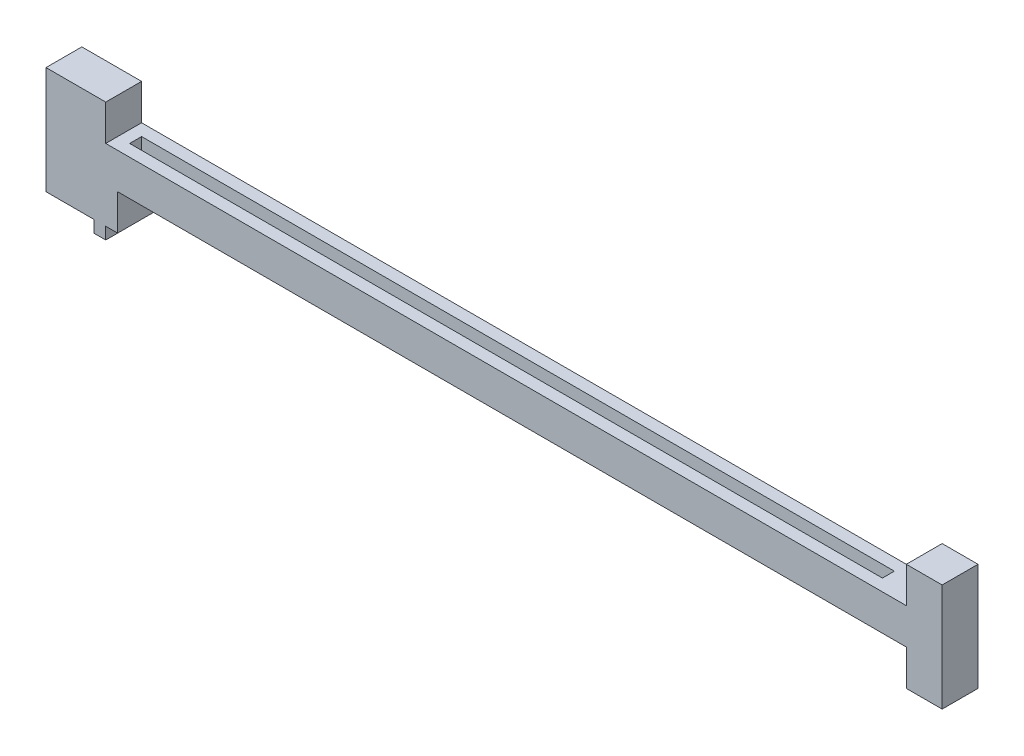
ISO-10303-21;
HEADER;
FILE_DESCRIPTION(('STEP AP214'),'2;1');
FILE_NAME('part.step','',(''),(''),'','','');
FILE_SCHEMA(('AUTOMOTIVE_DESIGN { 1 0 10303 214 1 1 1 1 }'));
ENDSEC;
DATA;
#1=APPLICATION_CONTEXT('core data for automotive mechanical design processes');
#2=APPLICATION_PROTOCOL_DEFINITION('international standard','automotive_design',2000,#1);
#3=PRODUCT_CONTEXT('',#1,'mechanical');
#4=PRODUCT('Part','Part','',(#3));
#5=PRODUCT_RELATED_PRODUCT_CATEGORY('part','',(#4));
#6=PRODUCT_DEFINITION_FORMATION('','',#4);
#7=PRODUCT_DEFINITION_CONTEXT('part definition',#1,'design');
#8=PRODUCT_DEFINITION('design','',#6,#7);
#9=PRODUCT_DEFINITION_SHAPE('','',#8);
#10=(LENGTH_UNIT() NAMED_UNIT(*) SI_UNIT(.MILLI.,.METRE.));
#11=(NAMED_UNIT(*) PLANE_ANGLE_UNIT() SI_UNIT($,.RADIAN.));
#12=(NAMED_UNIT(*) SI_UNIT($,.STERADIAN.) SOLID_ANGLE_UNIT());
#13=UNCERTAINTY_MEASURE_WITH_UNIT(LENGTH_MEASURE(1.E-05),#10,'distance_accuracy_value','');
#14=(GEOMETRIC_REPRESENTATION_CONTEXT(3) GLOBAL_UNCERTAINTY_ASSIGNED_CONTEXT((#13)) GLOBAL_UNIT_ASSIGNED_CONTEXT((#10,
#11,#12)) REPRESENTATION_CONTEXT('',''));
#15=CARTESIAN_POINT('',(0.,0.,0.));
#16=DIRECTION('',(0.,0.,1.));
#17=DIRECTION('',(1.,0.,0.));
#18=AXIS2_PLACEMENT_3D('',#15,#16,#17);
#19=CARTESIAN_POINT('',(-55.,-2.5,5.));
#20=DIRECTION('',(0.,1.,0.));
#21=DIRECTION('',(0.,0.,1.));
#22=AXIS2_PLACEMENT_3D('',#19,#20,#21);
#23=PLANE('',#22);
#24=DIRECTION('',(1.,0.,0.));
#25=VECTOR('',#24,1.);
#26=CARTESIAN_POINT('',(-55.,-2.5,3.33333333333333));
#27=LINE('',#26,#25);
#28=CARTESIAN_POINT('',(-55.,-2.5,3.33333333333333));
#29=VERTEX_POINT('',#28);
#30=CARTESIAN_POINT('',(50.,-2.5,3.33333333333333));
#31=VERTEX_POINT('',#30);
#32=EDGE_CURVE('E365',#29,#31,#27,.T.);
#33=ORIENTED_EDGE('',*,*,#32,.T.);
#34=DIRECTION('',(0.,0.,-1.));
#35=VECTOR('',#34,1.);
#36=CARTESIAN_POINT('',(50.,-2.5,3.33333333333333));
#37=LINE('',#36,#35);
#38=CARTESIAN_POINT('',(50.,-2.5,1.66666666666667));
#39=VERTEX_POINT('',#38);
#40=EDGE_CURVE('E361',#31,#39,#37,.T.);
#41=ORIENTED_EDGE('',*,*,#40,.T.);
#42=DIRECTION('',(1.,0.,0.));
#43=VECTOR('',#42,1.);
#44=CARTESIAN_POINT('',(-55.,-2.5,1.66666666666667));
#45=LINE('',#44,#43);
#46=CARTESIAN_POINT('',(-55.,-2.5,1.66666666666667));
#47=VERTEX_POINT('',#46);
#48=EDGE_CURVE('E358',#47,#39,#45,.T.);
#49=ORIENTED_EDGE('',*,*,#48,.F.);
#50=DIRECTION('',(0.,0.,-1.));
#51=VECTOR('',#50,1.);
#52=CARTESIAN_POINT('',(-55.,-2.5,5.));
#53=LINE('',#52,#51);
#54=CARTESIAN_POINT('',(-55.,-2.5,0.));
#55=VERTEX_POINT('',#54);
#56=EDGE_CURVE('E295',#47,#55,#53,.T.);
#57=ORIENTED_EDGE('',*,*,#56,.T.);
#58=DIRECTION('',(1.,0.,0.));
#59=VECTOR('',#58,1.);
#60=CARTESIAN_POINT('',(-55.,-2.5,0.));
#61=LINE('',#60,#59);
#62=CARTESIAN_POINT('',(55.,-2.5,0.));
#63=VERTEX_POINT('',#62);
#64=EDGE_CURVE('E252',#55,#63,#61,.T.);
#65=ORIENTED_EDGE('',*,*,#64,.T.);
#66=DIRECTION('',(0.,0.,-1.));
#67=VECTOR('',#66,1.);
#68=CARTESIAN_POINT('',(55.,-2.5,5.));
#69=LINE('',#68,#67);
#70=CARTESIAN_POINT('',(55.,-2.5,5.));
#71=VERTEX_POINT('',#70);
#72=EDGE_CURVE('E291',#71,#63,#69,.T.);
#73=ORIENTED_EDGE('',*,*,#72,.F.);
#74=DIRECTION('',(1.,0.,0.));
#75=VECTOR('',#74,1.);
#76=CARTESIAN_POINT('',(-55.,-2.5,5.));
#77=LINE('',#76,#75);
#78=CARTESIAN_POINT('',(-55.,-2.5,5.));
#79=VERTEX_POINT('',#78);
#80=EDGE_CURVE('E329',#79,#71,#77,.T.);
#81=ORIENTED_EDGE('',*,*,#80,.F.);
#82=EDGE_CURVE('E296',#79,#29,#53,.T.);
#83=ORIENTED_EDGE('',*,*,#82,.T.);
#84=EDGE_LOOP('',(#33,#41,#49,#57,#65,#73,#81,#83));
#85=FACE_BOUND('',#84,.T.);
#86=ADVANCED_FACE('F48',(#85),#23,.F.);
#87=CARTESIAN_POINT('',(-55.,2.5,5.));
#88=DIRECTION('',(0.,-1.,0.));
#89=DIRECTION('',(1.,0.,0.));
#90=AXIS2_PLACEMENT_3D('',#87,#88,#89);
#91=PLANE('',#90);
#92=DIRECTION('',(-1.,0.,0.));
#93=VECTOR('',#92,1.);
#94=CARTESIAN_POINT('',(-55.,2.5,0.));
#95=LINE('',#94,#93);
#96=CARTESIAN_POINT('',(55.,2.5,0.));
#97=VERTEX_POINT('',#96);
#98=CARTESIAN_POINT('',(-56.6666666666667,2.5,0.));
#99=VERTEX_POINT('',#98);
#100=EDGE_CURVE('E66',#97,#99,#95,.T.);
#101=ORIENTED_EDGE('',*,*,#100,.T.);
#102=DIRECTION('',(0.,0.,1.));
#103=VECTOR('',#102,1.);
#104=CARTESIAN_POINT('',(-56.6666666666667,2.5,0.));
#105=LINE('',#104,#103);
#106=CARTESIAN_POINT('',(-56.6666666666667,2.5,5.));
#107=VERTEX_POINT('',#106);
#108=EDGE_CURVE('E227',#99,#107,#105,.T.);
#109=ORIENTED_EDGE('',*,*,#108,.T.);
#110=DIRECTION('',(-1.,0.,0.));
#111=VECTOR('',#110,1.);
#112=CARTESIAN_POINT('',(-55.,2.5,5.));
#113=LINE('',#112,#111);
#114=CARTESIAN_POINT('',(55.,2.5,5.));
#115=VERTEX_POINT('',#114);
#116=EDGE_CURVE('E224',#115,#107,#113,.T.);
#117=ORIENTED_EDGE('',*,*,#116,.F.);
#118=DIRECTION('',(0.,0.,-1.));
#119=VECTOR('',#118,1.);
#120=CARTESIAN_POINT('',(55.,2.5,5.));
#121=LINE('',#120,#119);
#122=EDGE_CURVE('E234',#115,#97,#121,.T.);
#123=ORIENTED_EDGE('',*,*,#122,.T.);
#124=EDGE_LOOP('',(#101,#109,#117,#123));
#125=FACE_BOUND('',#124,.T.);
#126=DIRECTION('',(1.,0.,0.));
#127=VECTOR('',#126,1.);
#128=CARTESIAN_POINT('',(-55.,2.5,3.33333333333333));
#129=LINE('',#128,#127);
#130=CARTESIAN_POINT('',(-55.,2.5,3.33333333333333));
#131=VERTEX_POINT('',#130);
#132=CARTESIAN_POINT('',(50.,2.5,3.33333333333333));
#133=VERTEX_POINT('',#132);
#134=EDGE_CURVE('E383',#131,#133,#129,.T.);
#135=ORIENTED_EDGE('',*,*,#134,.F.);
#136=DIRECTION('',(0.,0.,-1.));
#137=VECTOR('',#136,1.);
#138=CARTESIAN_POINT('',(-55.,2.5,0.));
#139=LINE('',#138,#137);
#140=CARTESIAN_POINT('',(-55.,2.5,1.66666666666667));
#141=VERTEX_POINT('',#140);
#142=EDGE_CURVE('E226',#131,#141,#139,.T.);
#143=ORIENTED_EDGE('',*,*,#142,.T.);
#144=DIRECTION('',(1.,0.,0.));
#145=VECTOR('',#144,1.);
#146=CARTESIAN_POINT('',(-55.,2.5,1.66666666666667));
#147=LINE('',#146,#145);
#148=CARTESIAN_POINT('',(50.,2.5,1.66666666666667));
#149=VERTEX_POINT('',#148);
#150=EDGE_CURVE('E371',#141,#149,#147,.T.);
#151=ORIENTED_EDGE('',*,*,#150,.T.);
#152=DIRECTION('',(0.,0.,-1.));
#153=VECTOR('',#152,1.);
#154=CARTESIAN_POINT('',(50.,2.5,5.));
#155=LINE('',#154,#153);
#156=EDGE_CURVE('E11',#133,#149,#155,.T.);
#157=ORIENTED_EDGE('',*,*,#156,.F.);
#158=EDGE_LOOP('',(#135,#143,#151,#157));
#159=FACE_BOUND('',#158,.T.);
#160=ADVANCED_FACE('F350',(#125,#159),#91,.F.);
#161=CARTESIAN_POINT('',(-60.,-7.5,5.));
#162=DIRECTION('',(0.,1.,0.));
#163=DIRECTION('',(-1.,0.,0.));
#164=AXIS2_PLACEMENT_3D('',#161,#162,#163);
#165=PLANE('',#164);
#166=DIRECTION('',(0.,0.,-1.));
#167=VECTOR('',#166,1.);
#168=CARTESIAN_POINT('',(-58.3333333333333,-7.49999999999999,5.));
#169=LINE('',#168,#167);
#170=CARTESIAN_POINT('',(-58.3333333333333,-7.5,5.));
#171=VERTEX_POINT('',#170);
#172=CARTESIAN_POINT('',(-58.3333333333333,-7.5,0.));
#173=VERTEX_POINT('',#172);
#174=EDGE_CURVE('E391',#171,#173,#169,.T.);
#175=ORIENTED_EDGE('',*,*,#174,.F.);
#176=DIRECTION('',(1.,0.,0.));
#177=VECTOR('',#176,1.);
#178=CARTESIAN_POINT('',(-60.,-7.5,5.));
#179=LINE('',#178,#177);
#180=CARTESIAN_POINT('',(-65.,-7.5,5.));
#181=VERTEX_POINT('',#180);
#182=EDGE_CURVE('E436',#181,#171,#179,.T.);
#183=ORIENTED_EDGE('',*,*,#182,.F.);
#184=DIRECTION('',(0.,0.,1.));
#185=VECTOR('',#184,1.);
#186=CARTESIAN_POINT('',(-65.,-7.5,-15.8113883008419));
#187=LINE('',#186,#185);
#188=CARTESIAN_POINT('',(-65.,-7.5,0.));
#189=VERTEX_POINT('',#188);
#190=EDGE_CURVE('E392',#189,#181,#187,.T.);
#191=ORIENTED_EDGE('',*,*,#190,.F.);
#192=DIRECTION('',(1.,0.,0.));
#193=VECTOR('',#192,1.);
#194=CARTESIAN_POINT('',(-60.,-7.5,0.));
#195=LINE('',#194,#193);
#196=EDGE_CURVE('E244',#189,#173,#195,.T.);
#197=ORIENTED_EDGE('',*,*,#196,.T.);
#198=EDGE_LOOP('',(#175,#183,#191,#197));
#199=FACE_BOUND('',#198,.T.);
#200=ADVANCED_FACE('F50',(#199),#165,.F.);
#201=DIRECTION('',(0.,0.,1.));
#202=VECTOR('',#201,1.);
#203=CARTESIAN_POINT('',(-56.6666666666667,-7.49999999999999,5.));
#204=LINE('',#203,#202);
#205=CARTESIAN_POINT('',(-56.6666666666667,-7.49999999999999,0.));
#206=VERTEX_POINT('',#205);
#207=CARTESIAN_POINT('',(-56.6666666666667,-7.5,5.));
#208=VERTEX_POINT('',#207);
#209=EDGE_CURVE('E405',#206,#208,#204,.T.);
#210=ORIENTED_EDGE('',*,*,#209,.F.);
#211=CARTESIAN_POINT('',(-55.,-7.5,0.));
#212=VERTEX_POINT('',#211);
#213=EDGE_CURVE('E248',#206,#212,#195,.T.);
#214=ORIENTED_EDGE('',*,*,#213,.T.);
#215=DIRECTION('',(0.,0.,-1.));
#216=VECTOR('',#215,1.);
#217=CARTESIAN_POINT('',(-55.,-7.5,5.));
#218=LINE('',#217,#216);
#219=CARTESIAN_POINT('',(-55.,-7.5,5.));
#220=VERTEX_POINT('',#219);
#221=EDGE_CURVE('E57',#220,#212,#218,.T.);
#222=ORIENTED_EDGE('',*,*,#221,.F.);
#223=EDGE_CURVE('E274',#208,#220,#179,.T.);
#224=ORIENTED_EDGE('',*,*,#223,.F.);
#225=EDGE_LOOP('',(#210,#214,#222,#224));
#226=FACE_BOUND('',#225,.T.);
#227=ADVANCED_FACE('F455',(#226),#165,.F.);
#228=CARTESIAN_POINT('',(55.,-2.5,5.));
#229=DIRECTION('',(1.,0.,0.));
#230=DIRECTION('',(0.,0.,-1.));
#231=AXIS2_PLACEMENT_3D('',#228,#229,#230);
#232=PLANE('',#231);
#233=DIRECTION('',(0.,-1.,0.));
#234=VECTOR('',#233,1.);
#235=CARTESIAN_POINT('',(55.,-2.5,0.));
#236=LINE('',#235,#234);
#237=CARTESIAN_POINT('',(55.,-7.5,0.));
#238=VERTEX_POINT('',#237);
#239=EDGE_CURVE('E255',#63,#238,#236,.T.);
#240=ORIENTED_EDGE('',*,*,#239,.T.);
#241=DIRECTION('',(0.,0.,-1.));
#242=VECTOR('',#241,1.);
#243=CARTESIAN_POINT('',(55.,-7.5,5.));
#244=LINE('',#243,#242);
#245=CARTESIAN_POINT('',(55.,-7.5,5.));
#246=VERTEX_POINT('',#245);
#247=EDGE_CURVE('E287',#246,#238,#244,.T.);
#248=ORIENTED_EDGE('',*,*,#247,.F.);
#249=DIRECTION('',(0.,-1.,0.));
#250=VECTOR('',#249,1.);
#251=CARTESIAN_POINT('',(55.,-2.5,5.));
#252=LINE('',#251,#250);
#253=EDGE_CURVE('E325',#71,#246,#252,.T.);
#254=ORIENTED_EDGE('',*,*,#253,.F.);
#255=ORIENTED_EDGE('',*,*,#72,.T.);
#256=EDGE_LOOP('',(#240,#248,#254,#255));
#257=FACE_BOUND('',#256,.T.);
#258=ADVANCED_FACE('F323',(#257),#232,.F.);
#259=CARTESIAN_POINT('',(55.,-7.5,5.));
#260=DIRECTION('',(0.,1.,0.));
#261=DIRECTION('',(-1.,0.,0.));
#262=AXIS2_PLACEMENT_3D('',#259,#260,#261);
#263=PLANE('',#262);
#264=DIRECTION('',(1.,0.,0.));
#265=VECTOR('',#264,1.);
#266=CARTESIAN_POINT('',(55.,-7.5,0.));
#267=LINE('',#266,#265);
#268=CARTESIAN_POINT('',(60.,-7.5,0.));
#269=VERTEX_POINT('',#268);
#270=EDGE_CURVE('E258',#238,#269,#267,.T.);
#271=ORIENTED_EDGE('',*,*,#270,.T.);
#272=DIRECTION('',(0.,0.,-1.));
#273=VECTOR('',#272,1.);
#274=CARTESIAN_POINT('',(60.,-7.5,5.));
#275=LINE('',#274,#273);
#276=CARTESIAN_POINT('',(60.,-7.5,5.));
#277=VERTEX_POINT('',#276);
#278=EDGE_CURVE('E283',#277,#269,#275,.T.);
#279=ORIENTED_EDGE('',*,*,#278,.F.);
#280=DIRECTION('',(1.,0.,0.));
#281=VECTOR('',#280,1.);
#282=CARTESIAN_POINT('',(55.,-7.5,5.));
#283=LINE('',#282,#281);
#284=EDGE_CURVE('E328',#246,#277,#283,.T.);
#285=ORIENTED_EDGE('',*,*,#284,.F.);
#286=ORIENTED_EDGE('',*,*,#247,.T.);
#287=EDGE_LOOP('',(#271,#279,#285,#286));
#288=FACE_BOUND('',#287,.T.);
#289=ADVANCED_FACE('F483',(#288),#263,.F.);
#290=CARTESIAN_POINT('',(60.,7.5,5.));
#291=DIRECTION('',(-1.,0.,0.));
#292=DIRECTION('',(0.,0.,1.));
#293=AXIS2_PLACEMENT_3D('',#290,#291,#292);
#294=PLANE('',#293);
#295=DIRECTION('',(0.,1.,0.));
#296=VECTOR('',#295,1.);
#297=CARTESIAN_POINT('',(60.,7.5,0.));
#298=LINE('',#297,#296);
#299=CARTESIAN_POINT('',(60.,7.5,0.));
#300=VERTEX_POINT('',#299);
#301=EDGE_CURVE('E261',#269,#300,#298,.T.);
#302=ORIENTED_EDGE('',*,*,#301,.T.);
#303=DIRECTION('',(0.,0.,-1.));
#304=VECTOR('',#303,1.);
#305=CARTESIAN_POINT('',(60.,7.5,5.));
#306=LINE('',#305,#304);
#307=CARTESIAN_POINT('',(60.,7.5,5.));
#308=VERTEX_POINT('',#307);
#309=EDGE_CURVE('E279',#308,#300,#306,.T.);
#310=ORIENTED_EDGE('',*,*,#309,.F.);
#311=DIRECTION('',(0.,1.,0.));
#312=VECTOR('',#311,1.);
#313=CARTESIAN_POINT('',(60.,7.5,5.));
#314=LINE('',#313,#312);
#315=EDGE_CURVE('E333',#277,#308,#314,.T.);
#316=ORIENTED_EDGE('',*,*,#315,.F.);
#317=ORIENTED_EDGE('',*,*,#278,.T.);
#318=EDGE_LOOP('',(#302,#310,#316,#317));
#319=FACE_BOUND('',#318,.T.);
#320=ADVANCED_FACE('F480',(#319),#294,.F.);
#321=CARTESIAN_POINT('',(55.,7.5,5.));
#322=DIRECTION('',(0.,-1.,0.));
#323=DIRECTION('',(0.,0.,-1.));
#324=AXIS2_PLACEMENT_3D('',#321,#322,#323);
#325=PLANE('',#324);
#326=DIRECTION('',(-1.,0.,0.));
#327=VECTOR('',#326,1.);
#328=CARTESIAN_POINT('',(55.,7.5,0.));
#329=LINE('',#328,#327);
#330=CARTESIAN_POINT('',(55.,7.5,0.));
#331=VERTEX_POINT('',#330);
#332=EDGE_CURVE('E264',#300,#331,#329,.T.);
#333=ORIENTED_EDGE('',*,*,#332,.T.);
#334=DIRECTION('',(0.,0.,-1.));
#335=VECTOR('',#334,1.);
#336=CARTESIAN_POINT('',(55.,7.5,5.));
#337=LINE('',#336,#335);
#338=CARTESIAN_POINT('',(55.,7.5,5.));
#339=VERTEX_POINT('',#338);
#340=EDGE_CURVE('E238',#339,#331,#337,.T.);
#341=ORIENTED_EDGE('',*,*,#340,.F.);
#342=DIRECTION('',(-1.,0.,0.));
#343=VECTOR('',#342,1.);
#344=CARTESIAN_POINT('',(55.,7.5,5.));
#345=LINE('',#344,#343);
#346=EDGE_CURVE('E340',#308,#339,#345,.T.);
#347=ORIENTED_EDGE('',*,*,#346,.F.);
#348=ORIENTED_EDGE('',*,*,#309,.T.);
#349=EDGE_LOOP('',(#333,#341,#347,#348));
#350=FACE_BOUND('',#349,.T.);
#351=ADVANCED_FACE('F476',(#350),#325,.F.);
#352=CARTESIAN_POINT('',(55.,7.5,5.));
#353=DIRECTION('',(1.,0.,0.));
#354=DIRECTION('',(0.,0.,-1.));
#355=AXIS2_PLACEMENT_3D('',#352,#353,#354);
#356=PLANE('',#355);
#357=DIRECTION('',(0.,-1.,0.));
#358=VECTOR('',#357,1.);
#359=CARTESIAN_POINT('',(55.,7.5,0.));
#360=LINE('',#359,#358);
#361=EDGE_CURVE('E267',#331,#97,#360,.T.);
#362=ORIENTED_EDGE('',*,*,#361,.T.);
#363=ORIENTED_EDGE('',*,*,#122,.F.);
#364=DIRECTION('',(0.,-1.,0.));
#365=VECTOR('',#364,1.);
#366=CARTESIAN_POINT('',(55.,7.5,5.));
#367=LINE('',#366,#365);
#368=EDGE_CURVE('E240',#339,#115,#367,.T.);
#369=ORIENTED_EDGE('',*,*,#368,.F.);
#370=ORIENTED_EDGE('',*,*,#340,.T.);
#371=EDGE_LOOP('',(#362,#363,#369,#370));
#372=FACE_BOUND('',#371,.T.);
#373=ADVANCED_FACE('F348',(#372),#356,.F.);
#374=CARTESIAN_POINT('',(-55.,7.5,5.));
#375=DIRECTION('',(-1.,0.,0.));
#376=DIRECTION('',(0.,0.,1.));
#377=AXIS2_PLACEMENT_3D('',#374,#375,#376);
#378=PLANE('',#377);
#379=DIRECTION('',(0.,-1.,0.));
#380=VECTOR('',#379,1.);
#381=CARTESIAN_POINT('',(-55.,7.5,1.66666666666667));
#382=LINE('',#381,#380);
#383=EDGE_CURVE('E77',#141,#47,#382,.T.);
#384=ORIENTED_EDGE('',*,*,#383,.F.);
#385=ORIENTED_EDGE('',*,*,#142,.F.);
#386=DIRECTION('',(0.,-1.,0.));
#387=VECTOR('',#386,1.);
#388=CARTESIAN_POINT('',(-55.,7.5,3.33333333333333));
#389=LINE('',#388,#387);
#390=EDGE_CURVE('E368',#131,#29,#389,.T.);
#391=ORIENTED_EDGE('',*,*,#390,.T.);
#392=ORIENTED_EDGE('',*,*,#82,.F.);
#393=DIRECTION('',(0.,1.,0.));
#394=VECTOR('',#393,1.);
#395=CARTESIAN_POINT('',(-55.,-2.5,5.));
#396=LINE('',#395,#394);
#397=EDGE_CURVE('E309',#220,#79,#396,.T.);
#398=ORIENTED_EDGE('',*,*,#397,.F.);
#399=ORIENTED_EDGE('',*,*,#221,.T.);
#400=DIRECTION('',(0.,1.,0.));
#401=VECTOR('',#400,1.);
#402=CARTESIAN_POINT('',(-55.,-2.5,0.));
#403=LINE('',#402,#401);
#404=EDGE_CURVE('E247',#212,#55,#403,.T.);
#405=ORIENTED_EDGE('',*,*,#404,.T.);
#406=ORIENTED_EDGE('',*,*,#56,.F.);
#407=EDGE_LOOP('',(#384,#385,#391,#392,#398,#399,#405,#406));
#408=FACE_BOUND('',#407,.T.);
#409=ADVANCED_FACE('F305',(#408),#378,.F.);
#410=CARTESIAN_POINT('',(-60.,7.5,5.));
#411=DIRECTION('',(0.,-1.,0.));
#412=DIRECTION('',(0.,0.,-1.));
#413=AXIS2_PLACEMENT_3D('',#410,#411,#412);
#414=PLANE('',#413);
#415=DIRECTION('',(-1.,0.,0.));
#416=VECTOR('',#415,1.);
#417=CARTESIAN_POINT('',(-60.,7.5,5.));
#418=LINE('',#417,#416);
#419=CARTESIAN_POINT('',(-56.6666666666667,7.5,5.));
#420=VERTEX_POINT('',#419);
#421=CARTESIAN_POINT('',(-65.,7.5,5.));
#422=VERTEX_POINT('',#421);
#423=EDGE_CURVE('E221',#420,#422,#418,.T.);
#424=ORIENTED_EDGE('',*,*,#423,.F.);
#425=DIRECTION('',(0.,0.,1.));
#426=VECTOR('',#425,1.);
#427=CARTESIAN_POINT('',(-56.6666666666667,7.5,0.));
#428=LINE('',#427,#426);
#429=CARTESIAN_POINT('',(-56.6666666666667,7.5,0.));
#430=VERTEX_POINT('',#429);
#431=EDGE_CURVE('E207',#430,#420,#428,.T.);
#432=ORIENTED_EDGE('',*,*,#431,.F.);
#433=DIRECTION('',(-1.,0.,0.));
#434=VECTOR('',#433,1.);
#435=CARTESIAN_POINT('',(-60.,7.5,0.));
#436=LINE('',#435,#434);
#437=CARTESIAN_POINT('',(-65.,7.5,0.));
#438=VERTEX_POINT('',#437);
#439=EDGE_CURVE('E272',#430,#438,#436,.T.);
#440=ORIENTED_EDGE('',*,*,#439,.T.);
#441=DIRECTION('',(0.,0.,1.));
#442=VECTOR('',#441,1.);
#443=CARTESIAN_POINT('',(-65.,7.5,-15.8113883008419));
#444=LINE('',#443,#442);
#445=EDGE_CURVE('E231',#438,#422,#444,.T.);
#446=ORIENTED_EDGE('',*,*,#445,.T.);
#447=EDGE_LOOP('',(#424,#432,#440,#446));
#448=FACE_BOUND('',#447,.T.);
#449=ADVANCED_FACE('F229',(#448),#414,.F.);
#450=CARTESIAN_POINT('',(0.,0.,5.));
#451=DIRECTION('',(0.,0.,1.));
#452=DIRECTION('',(1.,0.,0.));
#453=AXIS2_PLACEMENT_3D('',#450,#451,#452);
#454=PLANE('',#453);
#455=ORIENTED_EDGE('',*,*,#116,.T.);
#456=DIRECTION('',(0.,1.,0.));
#457=VECTOR('',#456,1.);
#458=CARTESIAN_POINT('',(-56.6666666666667,-2.77046276694729,5.));
#459=LINE('',#458,#457);
#460=EDGE_CURVE('E210',#107,#420,#459,.T.);
#461=ORIENTED_EDGE('',*,*,#460,.T.);
#462=ORIENTED_EDGE('',*,*,#423,.T.);
#463=DIRECTION('',(0.,-1.,0.));
#464=VECTOR('',#463,1.);
#465=CARTESIAN_POINT('',(-65.,7.5,5.));
#466=LINE('',#465,#464);
#467=EDGE_CURVE('E386',#422,#181,#466,.T.);
#468=ORIENTED_EDGE('',*,*,#467,.T.);
#469=ORIENTED_EDGE('',*,*,#182,.T.);
#470=DIRECTION('',(0.,1.,0.));
#471=VECTOR('',#470,1.);
#472=CARTESIAN_POINT('',(-58.3333333333333,-9.16666666666665,5.));
#473=LINE('',#472,#471);
#474=CARTESIAN_POINT('',(-58.3333333333333,-9.16666666666665,5.));
#475=VERTEX_POINT('',#474);
#476=EDGE_CURVE('E414',#475,#171,#473,.T.);
#477=ORIENTED_EDGE('',*,*,#476,.F.);
#478=DIRECTION('',(-1.,0.,0.));
#479=VECTOR('',#478,1.);
#480=CARTESIAN_POINT('',(-58.3333333333333,-9.16666666666665,5.));
#481=LINE('',#480,#479);
#482=CARTESIAN_POINT('',(-56.6666666666667,-9.16666666666665,5.));
#483=VERTEX_POINT('',#482);
#484=EDGE_CURVE('E411',#483,#475,#481,.T.);
#485=ORIENTED_EDGE('',*,*,#484,.F.);
#486=DIRECTION('',(0.,1.,0.));
#487=VECTOR('',#486,1.);
#488=CARTESIAN_POINT('',(-56.6666666666667,-9.16666666666665,5.));
#489=LINE('',#488,#487);
#490=EDGE_CURVE('E424',#483,#208,#489,.T.);
#491=ORIENTED_EDGE('',*,*,#490,.T.);
#492=ORIENTED_EDGE('',*,*,#223,.T.);
#493=ORIENTED_EDGE('',*,*,#397,.T.);
#494=ORIENTED_EDGE('',*,*,#80,.T.);
#495=ORIENTED_EDGE('',*,*,#253,.T.);
#496=ORIENTED_EDGE('',*,*,#284,.T.);
#497=ORIENTED_EDGE('',*,*,#315,.T.);
#498=ORIENTED_EDGE('',*,*,#346,.T.);
#499=ORIENTED_EDGE('',*,*,#368,.T.);
#500=EDGE_LOOP('',(#455,#461,#462,#468,#469,#477,#485,#491,#492,#493,#494,#495,#496,#497,#498,#499));
#501=FACE_BOUND('',#500,.T.);
#502=ADVANCED_FACE('F219',(#501),#454,.T.);
#503=CARTESIAN_POINT('',(0.,0.,0.));
#504=DIRECTION('',(0.,0.,1.));
#505=DIRECTION('',(1.,0.,0.));
#506=AXIS2_PLACEMENT_3D('',#503,#504,#505);
#507=PLANE('',#506);
#508=DIRECTION('',(0.,1.,0.));
#509=VECTOR('',#508,1.);
#510=CARTESIAN_POINT('',(-56.6666666666667,-2.77046276694729,0.));
#511=LINE('',#510,#509);
#512=EDGE_CURVE('E212',#99,#430,#511,.T.);
#513=ORIENTED_EDGE('',*,*,#512,.F.);
#514=ORIENTED_EDGE('',*,*,#100,.F.);
#515=ORIENTED_EDGE('',*,*,#361,.F.);
#516=ORIENTED_EDGE('',*,*,#332,.F.);
#517=ORIENTED_EDGE('',*,*,#301,.F.);
#518=ORIENTED_EDGE('',*,*,#270,.F.);
#519=ORIENTED_EDGE('',*,*,#239,.F.);
#520=ORIENTED_EDGE('',*,*,#64,.F.);
#521=ORIENTED_EDGE('',*,*,#404,.F.);
#522=ORIENTED_EDGE('',*,*,#213,.F.);
#523=DIRECTION('',(0.,1.,0.));
#524=VECTOR('',#523,1.);
#525=CARTESIAN_POINT('',(-56.6666666666667,-9.16666666666665,0.));
#526=LINE('',#525,#524);
#527=CARTESIAN_POINT('',(-56.6666666666667,-9.16666666666665,0.));
#528=VERTEX_POINT('',#527);
#529=EDGE_CURVE('E428',#528,#206,#526,.T.);
#530=ORIENTED_EDGE('',*,*,#529,.F.);
#531=DIRECTION('',(1.,0.,0.));
#532=VECTOR('',#531,1.);
#533=CARTESIAN_POINT('',(-58.3333333333333,-9.16666666666665,0.));
#534=LINE('',#533,#532);
#535=CARTESIAN_POINT('',(-58.3333333333333,-9.16666666666665,0.));
#536=VERTEX_POINT('',#535);
#537=EDGE_CURVE('E404',#536,#528,#534,.T.);
#538=ORIENTED_EDGE('',*,*,#537,.F.);
#539=DIRECTION('',(0.,1.,0.));
#540=VECTOR('',#539,1.);
#541=CARTESIAN_POINT('',(-58.3333333333333,-9.16666666666665,0.));
#542=LINE('',#541,#540);
#543=EDGE_CURVE('E432',#536,#173,#542,.T.);
#544=ORIENTED_EDGE('',*,*,#543,.T.);
#545=ORIENTED_EDGE('',*,*,#196,.F.);
#546=DIRECTION('',(0.,1.,0.));
#547=VECTOR('',#546,1.);
#548=CARTESIAN_POINT('',(-65.,7.5,0.));
#549=LINE('',#548,#547);
#550=EDGE_CURVE('E387',#189,#438,#549,.T.);
#551=ORIENTED_EDGE('',*,*,#550,.T.);
#552=ORIENTED_EDGE('',*,*,#439,.F.);
#553=EDGE_LOOP('',(#513,#514,#515,#516,#517,#518,#519,#520,#521,#522,#530,#538,#544,#545,#551,#552));
#554=FACE_BOUND('',#553,.T.);
#555=ADVANCED_FACE('F312',(#554),#507,.F.);
#556=CARTESIAN_POINT('',(-58.3333333333333,-9.16666666666665,5.));
#557=DIRECTION('',(1.,0.,0.));
#558=DIRECTION('',(0.,0.,-1.));
#559=AXIS2_PLACEMENT_3D('',#556,#557,#558);
#560=PLANE('',#559);
#561=ORIENTED_EDGE('',*,*,#174,.T.);
#562=ORIENTED_EDGE('',*,*,#543,.F.);
#563=DIRECTION('',(0.,0.,-1.));
#564=VECTOR('',#563,1.);
#565=CARTESIAN_POINT('',(-58.3333333333333,-9.16666666666665,5.));
#566=LINE('',#565,#564);
#567=EDGE_CURVE('E400',#475,#536,#566,.T.);
#568=ORIENTED_EDGE('',*,*,#567,.F.);
#569=ORIENTED_EDGE('',*,*,#476,.T.);
#570=EDGE_LOOP('',(#561,#562,#568,#569));
#571=FACE_BOUND('',#570,.T.);
#572=ADVANCED_FACE('F467',(#571),#560,.F.);
#573=CARTESIAN_POINT('',(-56.6666666666667,-9.16666666666665,5.));
#574=DIRECTION('',(-1.,0.,0.));
#575=DIRECTION('',(0.,0.,1.));
#576=AXIS2_PLACEMENT_3D('',#573,#574,#575);
#577=PLANE('',#576);
#578=ORIENTED_EDGE('',*,*,#209,.T.);
#579=ORIENTED_EDGE('',*,*,#490,.F.);
#580=DIRECTION('',(0.,0.,1.));
#581=VECTOR('',#580,1.);
#582=CARTESIAN_POINT('',(-56.6666666666667,-9.16666666666665,5.));
#583=LINE('',#582,#581);
#584=EDGE_CURVE('E408',#528,#483,#583,.T.);
#585=ORIENTED_EDGE('',*,*,#584,.F.);
#586=ORIENTED_EDGE('',*,*,#529,.T.);
#587=EDGE_LOOP('',(#578,#579,#585,#586));
#588=FACE_BOUND('',#587,.T.);
#589=ADVANCED_FACE('F459',(#588),#577,.F.);
#590=CARTESIAN_POINT('',(0.,-9.16666666666665,0.));
#591=DIRECTION('',(0.,-1.,0.));
#592=DIRECTION('',(0.,0.,-1.));
#593=AXIS2_PLACEMENT_3D('',#590,#591,#592);
#594=PLANE('',#593);
#595=ORIENTED_EDGE('',*,*,#567,.T.);
#596=ORIENTED_EDGE('',*,*,#537,.T.);
#597=ORIENTED_EDGE('',*,*,#584,.T.);
#598=ORIENTED_EDGE('',*,*,#484,.T.);
#599=EDGE_LOOP('',(#595,#596,#597,#598));
#600=FACE_BOUND('',#599,.T.);
#601=ADVANCED_FACE('F463',(#600),#594,.T.);
#602=CARTESIAN_POINT('',(-65.,7.5,-15.8113883008419));
#603=DIRECTION('',(-1.,0.,0.));
#604=DIRECTION('',(0.,0.,1.));
#605=AXIS2_PLACEMENT_3D('',#602,#603,#604);
#606=PLANE('',#605);
#607=ORIENTED_EDGE('',*,*,#550,.F.);
#608=ORIENTED_EDGE('',*,*,#190,.T.);
#609=ORIENTED_EDGE('',*,*,#467,.F.);
#610=ORIENTED_EDGE('',*,*,#445,.F.);
#611=EDGE_LOOP('',(#607,#608,#609,#610));
#612=FACE_BOUND('',#611,.T.);
#613=ADVANCED_FACE('F472',(#612),#606,.T.);
#614=CARTESIAN_POINT('',(50.,7.5,3.33333333333333));
#615=DIRECTION('',(-1.,0.,0.));
#616=DIRECTION('',(0.,0.,1.));
#617=AXIS2_PLACEMENT_3D('',#614,#615,#616);
#618=PLANE('',#617);
#619=ORIENTED_EDGE('',*,*,#156,.T.);
#620=DIRECTION('',(0.,-1.,0.));
#621=VECTOR('',#620,1.);
#622=CARTESIAN_POINT('',(50.,7.5,1.66666666666667));
#623=LINE('',#622,#621);
#624=EDGE_CURVE('E375',#149,#39,#623,.T.);
#625=ORIENTED_EDGE('',*,*,#624,.T.);
#626=ORIENTED_EDGE('',*,*,#40,.F.);
#627=DIRECTION('',(0.,-1.,0.));
#628=VECTOR('',#627,1.);
#629=CARTESIAN_POINT('',(50.,7.5,3.33333333333333));
#630=LINE('',#629,#628);
#631=EDGE_CURVE('E372',#133,#31,#630,.T.);
#632=ORIENTED_EDGE('',*,*,#631,.F.);
#633=EDGE_LOOP('',(#619,#625,#626,#632));
#634=FACE_BOUND('',#633,.T.);
#635=ADVANCED_FACE('F449',(#634),#618,.T.);
#636=CARTESIAN_POINT('',(-55.,7.5,3.33333333333333));
#637=DIRECTION('',(0.,0.,-1.));
#638=DIRECTION('',(-1.,0.,0.));
#639=AXIS2_PLACEMENT_3D('',#636,#637,#638);
#640=PLANE('',#639);
#641=ORIENTED_EDGE('',*,*,#134,.T.);
#642=ORIENTED_EDGE('',*,*,#631,.T.);
#643=ORIENTED_EDGE('',*,*,#32,.F.);
#644=ORIENTED_EDGE('',*,*,#390,.F.);
#645=EDGE_LOOP('',(#641,#642,#643,#644));
#646=FACE_BOUND('',#645,.T.);
#647=ADVANCED_FACE('F444',(#646),#640,.T.);
#648=CARTESIAN_POINT('',(-55.,7.5,1.66666666666667));
#649=DIRECTION('',(0.,0.,-1.));
#650=DIRECTION('',(-1.,0.,0.));
#651=AXIS2_PLACEMENT_3D('',#648,#649,#650);
#652=PLANE('',#651);
#653=ORIENTED_EDGE('',*,*,#383,.T.);
#654=ORIENTED_EDGE('',*,*,#48,.T.);
#655=ORIENTED_EDGE('',*,*,#624,.F.);
#656=ORIENTED_EDGE('',*,*,#150,.F.);
#657=EDGE_LOOP('',(#653,#654,#655,#656));
#658=FACE_BOUND('',#657,.T.);
#659=ADVANCED_FACE('F450',(#658),#652,.F.);
#660=CARTESIAN_POINT('',(-56.6666666666667,-2.77046276694729,0.));
#661=DIRECTION('',(-1.,0.,0.));
#662=DIRECTION('',(0.,0.,1.));
#663=AXIS2_PLACEMENT_3D('',#660,#661,#662);
#664=PLANE('',#663);
#665=ORIENTED_EDGE('',*,*,#512,.T.);
#666=ORIENTED_EDGE('',*,*,#431,.T.);
#667=ORIENTED_EDGE('',*,*,#460,.F.);
#668=ORIENTED_EDGE('',*,*,#108,.F.);
#669=EDGE_LOOP('',(#665,#666,#667,#668));
#670=FACE_BOUND('',#669,.T.);
#671=ADVANCED_FACE('F209',(#670),#664,.F.);
#672=CLOSED_SHELL('',(#86,#160,#200,#227,#258,#289,#320,#351,#373,#409,#449,#502,#555,#572,#589,
#601,#613,#635,#647,#659,#671));
#673=MANIFOLD_SOLID_BREP('B2',#672);
#674=ADVANCED_BREP_SHAPE_REPRESENTATION('',(#18,#673),#14);
#675=SHAPE_DEFINITION_REPRESENTATION(#9,#674);
ENDSEC;
END-ISO-10303-21;
